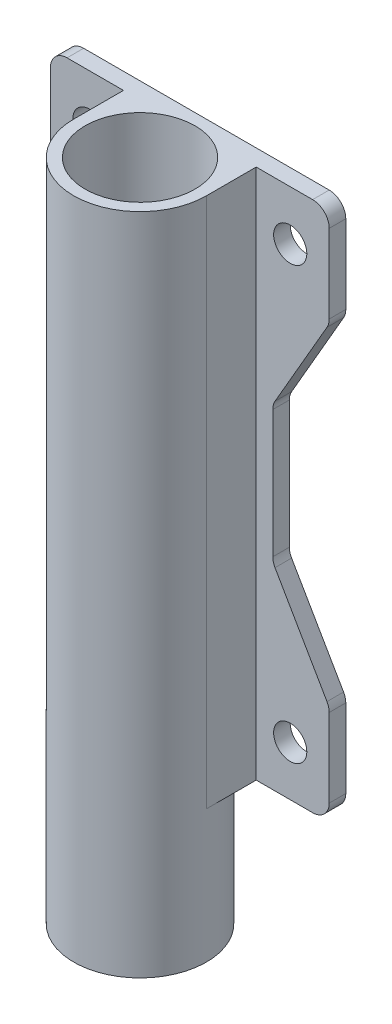
ISO-10303-21;
HEADER;
FILE_DESCRIPTION(('STEP AP214'),'2;1');
FILE_NAME('part.step','',(''),(''),'','','');
FILE_SCHEMA(('AUTOMOTIVE_DESIGN { 1 0 10303 214 1 1 1 1 }'));
ENDSEC;
DATA;
#1=APPLICATION_CONTEXT('core data for automotive mechanical design processes');
#2=APPLICATION_PROTOCOL_DEFINITION('international standard','automotive_design',2000,#1);
#3=PRODUCT_CONTEXT('',#1,'mechanical');
#4=PRODUCT('Part','Part','',(#3));
#5=PRODUCT_RELATED_PRODUCT_CATEGORY('part','',(#4));
#6=PRODUCT_DEFINITION_FORMATION('','',#4);
#7=PRODUCT_DEFINITION_CONTEXT('part definition',#1,'design');
#8=PRODUCT_DEFINITION('design','',#6,#7);
#9=PRODUCT_DEFINITION_SHAPE('','',#8);
#10=(LENGTH_UNIT() NAMED_UNIT(*) SI_UNIT(.MILLI.,.METRE.));
#11=(NAMED_UNIT(*) PLANE_ANGLE_UNIT() SI_UNIT($,.RADIAN.));
#12=(NAMED_UNIT(*) SI_UNIT($,.STERADIAN.) SOLID_ANGLE_UNIT());
#13=UNCERTAINTY_MEASURE_WITH_UNIT(LENGTH_MEASURE(1.E-05),#10,'distance_accuracy_value','');
#14=(GEOMETRIC_REPRESENTATION_CONTEXT(3) GLOBAL_UNCERTAINTY_ASSIGNED_CONTEXT((#13)) GLOBAL_UNIT_ASSIGNED_CONTEXT((#10,
#11,#12)) REPRESENTATION_CONTEXT('',''));
#15=CARTESIAN_POINT('',(0.,0.,0.));
#16=DIRECTION('',(0.,0.,1.));
#17=DIRECTION('',(1.,0.,0.));
#18=AXIS2_PLACEMENT_3D('',#15,#16,#17);
#19=CARTESIAN_POINT('',(-53.34,-101.6,6.35));
#20=DIRECTION('',(0.,1.,0.));
#21=DIRECTION('',(-1.,0.,0.));
#22=AXIS2_PLACEMENT_3D('',#19,#20,#21);
#23=PLANE('',#22);
#24=DIRECTION('',(1.,0.,0.));
#25=VECTOR('',#24,1.);
#26=CARTESIAN_POINT('',(-53.34,-101.6,0.));
#27=LINE('',#26,#25);
#28=CARTESIAN_POINT('',(0.,-101.6,0.));
#29=VERTEX_POINT('',#28);
#30=CARTESIAN_POINT('',(46.99,-101.6,0.));
#31=VERTEX_POINT('',#30);
#32=EDGE_CURVE('E239',#29,#31,#27,.T.);
#33=ORIENTED_EDGE('',*,*,#32,.T.);
#34=DIRECTION('',(0.,0.,-1.));
#35=VECTOR('',#34,1.);
#36=CARTESIAN_POINT('',(46.99,-101.6,6.35));
#37=LINE('',#36,#35);
#38=CARTESIAN_POINT('',(46.99,-101.6,6.35));
#39=VERTEX_POINT('',#38);
#40=EDGE_CURVE('E420',#31,#39,#37,.F.);
#41=ORIENTED_EDGE('',*,*,#40,.T.);
#42=DIRECTION('',(1.,0.,0.));
#43=VECTOR('',#42,1.);
#44=CARTESIAN_POINT('',(-53.34,-101.6,6.35));
#45=LINE('',#44,#43);
#46=CARTESIAN_POINT('',(25.4,-101.6,6.35));
#47=VERTEX_POINT('',#46);
#48=EDGE_CURVE('E341',#47,#39,#45,.T.);
#49=ORIENTED_EDGE('',*,*,#48,.F.);
#50=DIRECTION('',(0.,0.,-1.));
#51=VECTOR('',#50,1.);
#52=CARTESIAN_POINT('',(25.4,-101.6,0.));
#53=LINE('',#52,#51);
#54=CARTESIAN_POINT('',(25.4,-101.6,25.4));
#55=VERTEX_POINT('',#54);
#56=EDGE_CURVE('E256',#55,#47,#53,.T.);
#57=ORIENTED_EDGE('',*,*,#56,.F.);
#58=CARTESIAN_POINT('',(0.,-101.6,25.4));
#59=DIRECTION('',(0.,-1.,0.));
#60=DIRECTION('',(0.,0.,-1.));
#61=AXIS2_PLACEMENT_3D('',#58,#59,#60);
#62=CIRCLE('',#61,25.4);
#63=EDGE_CURVE('E253',#29,#55,#62,.T.);
#64=ORIENTED_EDGE('',*,*,#63,.F.);
#65=EDGE_LOOP('',(#33,#41,#49,#57,#64));
#66=FACE_BOUND('',#65,.T.);
#67=ADVANCED_FACE('F39',(#66),#23,.F.);
#68=CARTESIAN_POINT('',(0.,0.,6.35));
#69=DIRECTION('',(0.,0.,-1.));
#70=DIRECTION('',(-1.,0.,0.));
#71=AXIS2_PLACEMENT_3D('',#68,#69,#70);
#72=PLANE('',#71);
#73=CARTESIAN_POINT('',(38.4175,82.55,6.35));
#74=DIRECTION('',(0.,0.,1.));
#75=DIRECTION('',(-1.,0.,0.));
#76=AXIS2_PLACEMENT_3D('',#73,#74,#75);
#77=CIRCLE('',#76,6.35);
#78=CARTESIAN_POINT('',(32.0675,82.55,6.35));
#79=VERTEX_POINT('',#78);
#80=EDGE_CURVE('E297',#79,#79,#77,.T.);
#81=ORIENTED_EDGE('',*,*,#80,.F.);
#82=EDGE_LOOP('',(#81));
#83=FACE_BOUND('',#82,.T.);
#84=CARTESIAN_POINT('',(38.4175,-82.55,6.35));
#85=DIRECTION('',(0.,0.,1.));
#86=DIRECTION('',(1.,0.,0.));
#87=AXIS2_PLACEMENT_3D('',#84,#85,#86);
#88=CIRCLE('',#87,6.35);
#89=CARTESIAN_POINT('',(44.7675,-82.55,6.35));
#90=VERTEX_POINT('',#89);
#91=EDGE_CURVE('E303',#90,#90,#88,.T.);
#92=ORIENTED_EDGE('',*,*,#91,.F.);
#93=EDGE_LOOP('',(#92));
#94=FACE_BOUND('',#93,.T.);
#95=DIRECTION('',(0.,1.,0.));
#96=VECTOR('',#95,1.);
#97=CARTESIAN_POINT('',(53.34,-101.6,6.35));
#98=LINE('',#97,#96);
#99=CARTESIAN_POINT('',(53.34,-95.25,6.35));
#100=VERTEX_POINT('',#99);
#101=CARTESIAN_POINT('',(53.34,-65.2014773719376,6.35));
#102=VERTEX_POINT('',#101);
#103=EDGE_CURVE('E344',#100,#102,#98,.T.);
#104=ORIENTED_EDGE('',*,*,#103,.T.);
#105=CARTESIAN_POINT('',(46.99,-65.2014773719376,6.35));
#106=DIRECTION('',(0.,0.,-1.));
#107=DIRECTION('',(-1.,0.,0.));
#108=AXIS2_PLACEMENT_3D('',#105,#106,#107);
#109=CIRCLE('',#108,6.35);
#110=CARTESIAN_POINT('',(52.4892613140312,-62.0264773719377,6.35));
#111=VERTEX_POINT('',#110);
#112=EDGE_CURVE('E418',#102,#111,#109,.F.);
#113=ORIENTED_EDGE('',*,*,#112,.T.);
#114=DIRECTION('',(-0.499999999999994,0.866025403784442,0.));
#115=VECTOR('',#114,1.);
#116=CARTESIAN_POINT('',(53.34,-63.5,6.35));
#117=LINE('',#116,#115);
#118=CARTESIAN_POINT('',(32.6007386859688,-27.5785456926497,6.35));
#119=VERTEX_POINT('',#118);
#120=EDGE_CURVE('E347',#111,#119,#117,.T.);
#121=ORIENTED_EDGE('',*,*,#120,.T.);
#122=CARTESIAN_POINT('',(38.1,-24.4035456926497,6.35));
#123=DIRECTION('',(0.,0.,-1.));
#124=DIRECTION('',(-1.,0.,0.));
#125=AXIS2_PLACEMENT_3D('',#122,#123,#124);
#126=CIRCLE('',#125,6.35);
#127=CARTESIAN_POINT('',(31.75,-24.4035456926497,6.35));
#128=VERTEX_POINT('',#127);
#129=EDGE_CURVE('E467',#119,#128,#126,.T.);
#130=ORIENTED_EDGE('',*,*,#129,.T.);
#131=DIRECTION('',(0.,1.,0.));
#132=VECTOR('',#131,1.);
#133=CARTESIAN_POINT('',(31.75,26.1050230645874,6.35));
#134=LINE('',#133,#132);
#135=CARTESIAN_POINT('',(31.75,24.4035456926498,6.35));
#136=VERTEX_POINT('',#135);
#137=EDGE_CURVE('E273',#128,#136,#134,.T.);
#138=ORIENTED_EDGE('',*,*,#137,.T.);
#139=CARTESIAN_POINT('',(38.1,24.4035456926498,6.35));
#140=DIRECTION('',(0.,0.,-1.));
#141=DIRECTION('',(-1.,0.,0.));
#142=AXIS2_PLACEMENT_3D('',#139,#140,#141);
#143=CIRCLE('',#142,6.35);
#144=CARTESIAN_POINT('',(32.6007386859688,27.5785456926497,6.35));
#145=VERTEX_POINT('',#144);
#146=EDGE_CURVE('E471',#136,#145,#143,.T.);
#147=ORIENTED_EDGE('',*,*,#146,.T.);
#148=DIRECTION('',(0.499999999999994,0.866025403784442,0.));
#149=VECTOR('',#148,1.);
#150=CARTESIAN_POINT('',(53.34,63.5,6.35));
#151=LINE('',#150,#149);
#152=CARTESIAN_POINT('',(52.4892613140312,62.0264773719376,6.35));
#153=VERTEX_POINT('',#152);
#154=EDGE_CURVE('E269',#145,#153,#151,.T.);
#155=ORIENTED_EDGE('',*,*,#154,.T.);
#156=CARTESIAN_POINT('',(46.99,65.2014773719376,6.35));
#157=DIRECTION('',(0.,0.,-1.));
#158=DIRECTION('',(-1.,0.,0.));
#159=AXIS2_PLACEMENT_3D('',#156,#157,#158);
#160=CIRCLE('',#159,6.35);
#161=CARTESIAN_POINT('',(53.34,65.2014773719376,6.35));
#162=VERTEX_POINT('',#161);
#163=EDGE_CURVE('E414',#153,#162,#160,.F.);
#164=ORIENTED_EDGE('',*,*,#163,.T.);
#165=DIRECTION('',(0.,1.,0.));
#166=VECTOR('',#165,1.);
#167=CARTESIAN_POINT('',(53.34,63.5,6.35));
#168=LINE('',#167,#166);
#169=CARTESIAN_POINT('',(53.34,95.25,6.35));
#170=VERTEX_POINT('',#169);
#171=EDGE_CURVE('E321',#162,#170,#168,.T.);
#172=ORIENTED_EDGE('',*,*,#171,.T.);
#173=CARTESIAN_POINT('',(46.99,95.25,6.35));
#174=DIRECTION('',(0.,0.,-1.));
#175=DIRECTION('',(-1.,0.,0.));
#176=AXIS2_PLACEMENT_3D('',#173,#174,#175);
#177=CIRCLE('',#176,6.35);
#178=CARTESIAN_POINT('',(46.99,101.6,6.35));
#179=VERTEX_POINT('',#178);
#180=EDGE_CURVE('E412',#170,#179,#177,.F.);
#181=ORIENTED_EDGE('',*,*,#180,.T.);
#182=DIRECTION('',(-1.,0.,0.));
#183=VECTOR('',#182,1.);
#184=CARTESIAN_POINT('',(-53.34,101.6,6.35));
#185=LINE('',#184,#183);
#186=CARTESIAN_POINT('',(25.4,101.6,6.35));
#187=VERTEX_POINT('',#186);
#188=EDGE_CURVE('E326',#179,#187,#185,.T.);
#189=ORIENTED_EDGE('',*,*,#188,.T.);
#190=DIRECTION('',(0.,-1.,0.));
#191=VECTOR('',#190,1.);
#192=CARTESIAN_POINT('',(25.4,173.442048968553,6.35));
#193=LINE('',#192,#191);
#194=EDGE_CURVE('E281',#187,#47,#193,.T.);
#195=ORIENTED_EDGE('',*,*,#194,.T.);
#196=ORIENTED_EDGE('',*,*,#48,.T.);
#197=CARTESIAN_POINT('',(46.99,-95.25,6.35));
#198=DIRECTION('',(0.,0.,-1.));
#199=DIRECTION('',(-1.,0.,0.));
#200=AXIS2_PLACEMENT_3D('',#197,#198,#199);
#201=CIRCLE('',#200,6.35);
#202=EDGE_CURVE('E416',#39,#100,#201,.F.);
#203=ORIENTED_EDGE('',*,*,#202,.T.);
#204=EDGE_LOOP('',(#104,#113,#121,#130,#138,#147,#155,#164,#172,#181,#189,#195,#196,#203));
#205=FACE_BOUND('',#204,.T.);
#206=ADVANCED_FACE('F542',(#83,#94,#205),#72,.F.);
#207=DIRECTION('',(0.,-1.,0.));
#208=VECTOR('',#207,1.);
#209=CARTESIAN_POINT('',(-53.34,-101.6,6.35));
#210=LINE('',#209,#208);
#211=CARTESIAN_POINT('',(-53.34,-65.2014773719376,6.35));
#212=VERTEX_POINT('',#211);
#213=CARTESIAN_POINT('',(-53.34,-95.25,6.35));
#214=VERTEX_POINT('',#213);
#215=EDGE_CURVE('E338',#212,#214,#210,.T.);
#216=ORIENTED_EDGE('',*,*,#215,.T.);
#217=CARTESIAN_POINT('',(-46.99,-95.25,6.35));
#218=DIRECTION('',(0.,0.,-1.));
#219=DIRECTION('',(-1.,0.,0.));
#220=AXIS2_PLACEMENT_3D('',#217,#218,#219);
#221=CIRCLE('',#220,6.35);
#222=CARTESIAN_POINT('',(-46.99,-101.6,6.35));
#223=VERTEX_POINT('',#222);
#224=EDGE_CURVE('E434',#214,#223,#221,.F.);
#225=ORIENTED_EDGE('',*,*,#224,.T.);
#226=CARTESIAN_POINT('',(-25.4,-101.6,6.35));
#227=VERTEX_POINT('',#226);
#228=EDGE_CURVE('E342',#223,#227,#45,.T.);
#229=ORIENTED_EDGE('',*,*,#228,.T.);
#230=DIRECTION('',(0.,-1.,0.));
#231=VECTOR('',#230,1.);
#232=CARTESIAN_POINT('',(-25.4,173.442048968553,6.35));
#233=LINE('',#232,#231);
#234=CARTESIAN_POINT('',(-25.4,101.6,6.35));
#235=VERTEX_POINT('',#234);
#236=EDGE_CURVE('E290',#235,#227,#233,.T.);
#237=ORIENTED_EDGE('',*,*,#236,.F.);
#238=CARTESIAN_POINT('',(-46.99,101.6,6.35));
#239=VERTEX_POINT('',#238);
#240=EDGE_CURVE('E324',#235,#239,#185,.T.);
#241=ORIENTED_EDGE('',*,*,#240,.T.);
#242=CARTESIAN_POINT('',(-46.99,95.25,6.35));
#243=DIRECTION('',(0.,0.,-1.));
#244=DIRECTION('',(-1.,0.,0.));
#245=AXIS2_PLACEMENT_3D('',#242,#243,#244);
#246=CIRCLE('',#245,6.35);
#247=CARTESIAN_POINT('',(-53.34,95.25,6.35));
#248=VERTEX_POINT('',#247);
#249=EDGE_CURVE('E428',#239,#248,#246,.F.);
#250=ORIENTED_EDGE('',*,*,#249,.T.);
#251=DIRECTION('',(0.,-1.,0.));
#252=VECTOR('',#251,1.);
#253=CARTESIAN_POINT('',(-53.34,63.5,6.35));
#254=LINE('',#253,#252);
#255=CARTESIAN_POINT('',(-53.34,65.2014773719376,6.35));
#256=VERTEX_POINT('',#255);
#257=EDGE_CURVE('E328',#248,#256,#254,.T.);
#258=ORIENTED_EDGE('',*,*,#257,.T.);
#259=CARTESIAN_POINT('',(-46.99,65.2014773719376,6.35));
#260=DIRECTION('',(0.,0.,-1.));
#261=DIRECTION('',(-1.,0.,0.));
#262=AXIS2_PLACEMENT_3D('',#259,#260,#261);
#263=CIRCLE('',#262,6.35);
#264=CARTESIAN_POINT('',(-52.4892613140312,62.0264773719376,6.35));
#265=VERTEX_POINT('',#264);
#266=EDGE_CURVE('E430',#256,#265,#263,.F.);
#267=ORIENTED_EDGE('',*,*,#266,.T.);
#268=DIRECTION('',(0.499999999999995,-0.866025403784442,0.));
#269=VECTOR('',#268,1.);
#270=CARTESIAN_POINT('',(-53.34,63.5,6.35));
#271=LINE('',#270,#269);
#272=CARTESIAN_POINT('',(-32.6007386859688,27.5785456926497,6.35));
#273=VERTEX_POINT('',#272);
#274=EDGE_CURVE('E331',#265,#273,#271,.T.);
#275=ORIENTED_EDGE('',*,*,#274,.T.);
#276=CARTESIAN_POINT('',(-38.1,24.4035456926497,6.35));
#277=DIRECTION('',(0.,0.,-1.));
#278=DIRECTION('',(-1.,0.,0.));
#279=AXIS2_PLACEMENT_3D('',#276,#277,#278);
#280=CIRCLE('',#279,6.35);
#281=CARTESIAN_POINT('',(-31.75,24.4035456926497,6.35));
#282=VERTEX_POINT('',#281);
#283=EDGE_CURVE('E475',#273,#282,#280,.T.);
#284=ORIENTED_EDGE('',*,*,#283,.T.);
#285=DIRECTION('',(0.,-1.,0.));
#286=VECTOR('',#285,1.);
#287=CARTESIAN_POINT('',(-31.75,26.1050230645874,6.35));
#288=LINE('',#287,#286);
#289=CARTESIAN_POINT('',(-31.75,-24.4035456926498,6.35));
#290=VERTEX_POINT('',#289);
#291=EDGE_CURVE('E334',#282,#290,#288,.T.);
#292=ORIENTED_EDGE('',*,*,#291,.T.);
#293=CARTESIAN_POINT('',(-38.1,-24.4035456926498,6.35));
#294=DIRECTION('',(0.,0.,-1.));
#295=DIRECTION('',(-1.,0.,0.));
#296=AXIS2_PLACEMENT_3D('',#293,#294,#295);
#297=CIRCLE('',#296,6.35);
#298=CARTESIAN_POINT('',(-32.6007386859688,-27.5785456926497,6.35));
#299=VERTEX_POINT('',#298);
#300=EDGE_CURVE('E11',#290,#299,#297,.T.);
#301=ORIENTED_EDGE('',*,*,#300,.T.);
#302=DIRECTION('',(-0.499999999999995,-0.866025403784442,0.));
#303=VECTOR('',#302,1.);
#304=CARTESIAN_POINT('',(-53.34,-63.5,6.35));
#305=LINE('',#304,#303);
#306=CARTESIAN_POINT('',(-52.4892613140312,-62.0264773719376,6.35));
#307=VERTEX_POINT('',#306);
#308=EDGE_CURVE('E336',#299,#307,#305,.T.);
#309=ORIENTED_EDGE('',*,*,#308,.T.);
#310=CARTESIAN_POINT('',(-46.99,-65.2014773719376,6.35));
#311=DIRECTION('',(0.,0.,-1.));
#312=DIRECTION('',(-1.,0.,0.));
#313=AXIS2_PLACEMENT_3D('',#310,#311,#312);
#314=CIRCLE('',#313,6.35);
#315=EDGE_CURVE('E432',#307,#212,#314,.F.);
#316=ORIENTED_EDGE('',*,*,#315,.T.);
#317=EDGE_LOOP('',(#216,#225,#229,#237,#241,#250,#258,#267,#275,#284,#292,#301,#309,#316));
#318=FACE_BOUND('',#317,.T.);
#319=CARTESIAN_POINT('',(-38.4175,82.55,6.35));
#320=DIRECTION('',(0.,0.,1.));
#321=DIRECTION('',(1.,0.,0.));
#322=AXIS2_PLACEMENT_3D('',#319,#320,#321);
#323=CIRCLE('',#322,6.35);
#324=CARTESIAN_POINT('',(-32.0675,82.55,6.35));
#325=VERTEX_POINT('',#324);
#326=EDGE_CURVE('E315',#325,#325,#323,.T.);
#327=ORIENTED_EDGE('',*,*,#326,.F.);
#328=EDGE_LOOP('',(#327));
#329=FACE_BOUND('',#328,.T.);
#330=CARTESIAN_POINT('',(-38.4175,-82.55,6.35));
#331=DIRECTION('',(0.,0.,1.));
#332=DIRECTION('',(-1.,0.,0.));
#333=AXIS2_PLACEMENT_3D('',#330,#331,#332);
#334=CIRCLE('',#333,6.35);
#335=CARTESIAN_POINT('',(-44.7675,-82.55,6.35));
#336=VERTEX_POINT('',#335);
#337=EDGE_CURVE('E309',#336,#336,#334,.T.);
#338=ORIENTED_EDGE('',*,*,#337,.F.);
#339=EDGE_LOOP('',(#338));
#340=FACE_BOUND('',#339,.T.);
#341=ADVANCED_FACE('F488',(#318,#329,#340),#72,.F.);
#342=CARTESIAN_POINT('',(0.,0.,0.));
#343=DIRECTION('',(0.,0.,-1.));
#344=DIRECTION('',(-1.,0.,0.));
#345=AXIS2_PLACEMENT_3D('',#342,#343,#344);
#346=PLANE('',#345);
#347=DIRECTION('',(-0.499999999999994,0.866025403784442,0.));
#348=VECTOR('',#347,1.);
#349=CARTESIAN_POINT('',(53.34,-63.5,0.));
#350=LINE('',#349,#348);
#351=CARTESIAN_POINT('',(52.4892613140312,-62.0264773719377,0.));
#352=VERTEX_POINT('',#351);
#353=CARTESIAN_POINT('',(32.6007386859688,-27.5785456926497,0.));
#354=VERTEX_POINT('',#353);
#355=EDGE_CURVE('E372',#352,#354,#350,.T.);
#356=ORIENTED_EDGE('',*,*,#355,.F.);
#357=CARTESIAN_POINT('',(46.99,-65.2014773719376,0.));
#358=DIRECTION('',(0.,0.,-1.));
#359=DIRECTION('',(-1.,0.,0.));
#360=AXIS2_PLACEMENT_3D('',#357,#358,#359);
#361=CIRCLE('',#360,6.35);
#362=CARTESIAN_POINT('',(53.34,-65.2014773719376,0.));
#363=VERTEX_POINT('',#362);
#364=EDGE_CURVE('E405',#352,#363,#361,.T.);
#365=ORIENTED_EDGE('',*,*,#364,.T.);
#366=DIRECTION('',(0.,1.,0.));
#367=VECTOR('',#366,1.);
#368=CARTESIAN_POINT('',(53.34,-101.6,0.));
#369=LINE('',#368,#367);
#370=CARTESIAN_POINT('',(53.34,-95.25,0.));
#371=VERTEX_POINT('',#370);
#372=EDGE_CURVE('E238',#371,#363,#369,.T.);
#373=ORIENTED_EDGE('',*,*,#372,.F.);
#374=CARTESIAN_POINT('',(46.99,-95.25,0.));
#375=DIRECTION('',(0.,0.,-1.));
#376=DIRECTION('',(-1.,0.,0.));
#377=AXIS2_PLACEMENT_3D('',#374,#375,#376);
#378=CIRCLE('',#377,6.35);
#379=EDGE_CURVE('E247',#371,#31,#378,.T.);
#380=ORIENTED_EDGE('',*,*,#379,.T.);
#381=ORIENTED_EDGE('',*,*,#32,.F.);
#382=CARTESIAN_POINT('',(-46.99,-101.6,0.));
#383=VERTEX_POINT('',#382);
#384=EDGE_CURVE('E227',#383,#29,#27,.T.);
#385=ORIENTED_EDGE('',*,*,#384,.F.);
#386=CARTESIAN_POINT('',(-46.99,-95.25,0.));
#387=DIRECTION('',(0.,0.,-1.));
#388=DIRECTION('',(-1.,0.,0.));
#389=AXIS2_PLACEMENT_3D('',#386,#387,#388);
#390=CIRCLE('',#389,6.35);
#391=CARTESIAN_POINT('',(-53.34,-95.25,0.));
#392=VERTEX_POINT('',#391);
#393=EDGE_CURVE('E402',#383,#392,#390,.T.);
#394=ORIENTED_EDGE('',*,*,#393,.T.);
#395=DIRECTION('',(0.,-1.,0.));
#396=VECTOR('',#395,1.);
#397=CARTESIAN_POINT('',(-53.34,-101.6,0.));
#398=LINE('',#397,#396);
#399=CARTESIAN_POINT('',(-53.34,-65.2014773719376,0.));
#400=VERTEX_POINT('',#399);
#401=EDGE_CURVE('E250',#400,#392,#398,.T.);
#402=ORIENTED_EDGE('',*,*,#401,.F.);
#403=CARTESIAN_POINT('',(-46.99,-65.2014773719376,0.));
#404=DIRECTION('',(0.,0.,-1.));
#405=DIRECTION('',(-1.,0.,0.));
#406=AXIS2_PLACEMENT_3D('',#403,#404,#405);
#407=CIRCLE('',#406,6.35);
#408=CARTESIAN_POINT('',(-52.4892613140312,-62.0264773719376,0.));
#409=VERTEX_POINT('',#408);
#410=EDGE_CURVE('E400',#400,#409,#407,.T.);
#411=ORIENTED_EDGE('',*,*,#410,.T.);
#412=DIRECTION('',(-0.499999999999995,-0.866025403784442,0.));
#413=VECTOR('',#412,1.);
#414=CARTESIAN_POINT('',(-53.34,-63.5,0.));
#415=LINE('',#414,#413);
#416=CARTESIAN_POINT('',(-32.6007386859688,-27.5785456926497,0.));
#417=VERTEX_POINT('',#416);
#418=EDGE_CURVE('E366',#417,#409,#415,.T.);
#419=ORIENTED_EDGE('',*,*,#418,.F.);
#420=CARTESIAN_POINT('',(-38.1,-24.4035456926498,0.));
#421=DIRECTION('',(0.,0.,-1.));
#422=DIRECTION('',(-1.,0.,0.));
#423=AXIS2_PLACEMENT_3D('',#420,#421,#422);
#424=CIRCLE('',#423,6.35);
#425=CARTESIAN_POINT('',(-31.75,-24.4035456926498,0.));
#426=VERTEX_POINT('',#425);
#427=EDGE_CURVE('E47',#417,#426,#424,.F.);
#428=ORIENTED_EDGE('',*,*,#427,.T.);
#429=DIRECTION('',(0.,-1.,0.));
#430=VECTOR('',#429,1.);
#431=CARTESIAN_POINT('',(-31.75,26.1050230645874,0.));
#432=LINE('',#431,#430);
#433=CARTESIAN_POINT('',(-31.75,24.4035456926497,0.));
#434=VERTEX_POINT('',#433);
#435=EDGE_CURVE('E363',#434,#426,#432,.T.);
#436=ORIENTED_EDGE('',*,*,#435,.F.);
#437=CARTESIAN_POINT('',(-38.1,24.4035456926497,0.));
#438=DIRECTION('',(0.,0.,-1.));
#439=DIRECTION('',(-1.,0.,0.));
#440=AXIS2_PLACEMENT_3D('',#437,#438,#439);
#441=CIRCLE('',#440,6.35);
#442=CARTESIAN_POINT('',(-32.6007386859688,27.5785456926497,0.));
#443=VERTEX_POINT('',#442);
#444=EDGE_CURVE('E473',#434,#443,#441,.F.);
#445=ORIENTED_EDGE('',*,*,#444,.T.);
#446=DIRECTION('',(0.499999999999995,-0.866025403784442,0.));
#447=VECTOR('',#446,1.);
#448=CARTESIAN_POINT('',(-53.34,63.5,0.));
#449=LINE('',#448,#447);
#450=CARTESIAN_POINT('',(-52.4892613140312,62.0264773719376,0.));
#451=VERTEX_POINT('',#450);
#452=EDGE_CURVE('E360',#451,#443,#449,.T.);
#453=ORIENTED_EDGE('',*,*,#452,.F.);
#454=CARTESIAN_POINT('',(-46.99,65.2014773719376,0.));
#455=DIRECTION('',(0.,0.,-1.));
#456=DIRECTION('',(-1.,0.,0.));
#457=AXIS2_PLACEMENT_3D('',#454,#455,#456);
#458=CIRCLE('',#457,6.35);
#459=CARTESIAN_POINT('',(-53.34,65.2014773719376,0.));
#460=VERTEX_POINT('',#459);
#461=EDGE_CURVE('E398',#451,#460,#458,.T.);
#462=ORIENTED_EDGE('',*,*,#461,.T.);
#463=DIRECTION('',(0.,-1.,0.));
#464=VECTOR('',#463,1.);
#465=CARTESIAN_POINT('',(-53.34,63.5,0.));
#466=LINE('',#465,#464);
#467=CARTESIAN_POINT('',(-53.34,95.25,0.));
#468=VERTEX_POINT('',#467);
#469=EDGE_CURVE('E357',#468,#460,#466,.T.);
#470=ORIENTED_EDGE('',*,*,#469,.F.);
#471=CARTESIAN_POINT('',(-46.99,95.25,0.));
#472=DIRECTION('',(0.,0.,-1.));
#473=DIRECTION('',(-1.,0.,0.));
#474=AXIS2_PLACEMENT_3D('',#471,#472,#473);
#475=CIRCLE('',#474,6.35);
#476=CARTESIAN_POINT('',(-46.99,101.6,0.));
#477=VERTEX_POINT('',#476);
#478=EDGE_CURVE('E392',#468,#477,#475,.T.);
#479=ORIENTED_EDGE('',*,*,#478,.T.);
#480=DIRECTION('',(-1.,0.,0.));
#481=VECTOR('',#480,1.);
#482=CARTESIAN_POINT('',(-53.34,101.6,0.));
#483=LINE('',#482,#481);
#484=CARTESIAN_POINT('',(46.99,101.6,0.));
#485=VERTEX_POINT('',#484);
#486=EDGE_CURVE('E354',#485,#477,#483,.T.);
#487=ORIENTED_EDGE('',*,*,#486,.F.);
#488=CARTESIAN_POINT('',(46.99,95.25,0.));
#489=DIRECTION('',(0.,0.,-1.));
#490=DIRECTION('',(-1.,0.,0.));
#491=AXIS2_PLACEMENT_3D('',#488,#489,#490);
#492=CIRCLE('',#491,6.35);
#493=CARTESIAN_POINT('',(53.34,95.25,0.));
#494=VERTEX_POINT('',#493);
#495=EDGE_CURVE('E394',#485,#494,#492,.T.);
#496=ORIENTED_EDGE('',*,*,#495,.T.);
#497=DIRECTION('',(0.,1.,0.));
#498=VECTOR('',#497,1.);
#499=CARTESIAN_POINT('',(53.34,63.5,0.));
#500=LINE('',#499,#498);
#501=CARTESIAN_POINT('',(53.34,65.2014773719376,0.));
#502=VERTEX_POINT('',#501);
#503=EDGE_CURVE('E318',#502,#494,#500,.T.);
#504=ORIENTED_EDGE('',*,*,#503,.F.);
#505=CARTESIAN_POINT('',(46.99,65.2014773719376,0.));
#506=DIRECTION('',(0.,0.,-1.));
#507=DIRECTION('',(-1.,0.,0.));
#508=AXIS2_PLACEMENT_3D('',#505,#506,#507);
#509=CIRCLE('',#508,6.35);
#510=CARTESIAN_POINT('',(52.4892613140312,62.0264773719376,0.));
#511=VERTEX_POINT('',#510);
#512=EDGE_CURVE('E396',#502,#511,#509,.T.);
#513=ORIENTED_EDGE('',*,*,#512,.T.);
#514=DIRECTION('',(0.499999999999994,0.866025403784442,0.));
#515=VECTOR('',#514,1.);
#516=CARTESIAN_POINT('',(53.34,63.5,0.));
#517=LINE('',#516,#515);
#518=CARTESIAN_POINT('',(32.6007386859688,27.5785456926497,0.));
#519=VERTEX_POINT('',#518);
#520=EDGE_CURVE('E325',#519,#511,#517,.T.);
#521=ORIENTED_EDGE('',*,*,#520,.F.);
#522=CARTESIAN_POINT('',(38.1,24.4035456926498,0.));
#523=DIRECTION('',(0.,0.,-1.));
#524=DIRECTION('',(-1.,0.,0.));
#525=AXIS2_PLACEMENT_3D('',#522,#523,#524);
#526=CIRCLE('',#525,6.35);
#527=CARTESIAN_POINT('',(31.75,24.4035456926498,0.));
#528=VERTEX_POINT('',#527);
#529=EDGE_CURVE('E469',#519,#528,#526,.F.);
#530=ORIENTED_EDGE('',*,*,#529,.T.);
#531=DIRECTION('',(0.,1.,0.));
#532=VECTOR('',#531,1.);
#533=CARTESIAN_POINT('',(31.75,26.1050230645874,0.));
#534=LINE('',#533,#532);
#535=CARTESIAN_POINT('',(31.75,-24.4035456926497,0.));
#536=VERTEX_POINT('',#535);
#537=EDGE_CURVE('E375',#536,#528,#534,.T.);
#538=ORIENTED_EDGE('',*,*,#537,.F.);
#539=CARTESIAN_POINT('',(38.1,-24.4035456926497,0.));
#540=DIRECTION('',(0.,0.,-1.));
#541=DIRECTION('',(-1.,0.,0.));
#542=AXIS2_PLACEMENT_3D('',#539,#540,#541);
#543=CIRCLE('',#542,6.35);
#544=EDGE_CURVE('E465',#536,#354,#543,.F.);
#545=ORIENTED_EDGE('',*,*,#544,.T.);
#546=EDGE_LOOP('',(#356,#365,#373,#380,#381,#385,#394,#402,#411,#419,#428,#436,#445,#453,#462,
#470,#479,#487,#496,#504,#513,#521,#530,#538,#545));
#547=FACE_BOUND('',#546,.T.);
#548=CARTESIAN_POINT('',(38.4175,-82.55,0.));
#549=DIRECTION('',(0.,0.,1.));
#550=DIRECTION('',(1.,0.,0.));
#551=AXIS2_PLACEMENT_3D('',#548,#549,#550);
#552=CIRCLE('',#551,6.35);
#553=CARTESIAN_POINT('',(44.7675,-82.55,0.));
#554=VERTEX_POINT('',#553);
#555=EDGE_CURVE('E300',#554,#554,#552,.T.);
#556=ORIENTED_EDGE('',*,*,#555,.T.);
#557=EDGE_LOOP('',(#556));
#558=FACE_BOUND('',#557,.T.);
#559=CARTESIAN_POINT('',(38.4175,82.55,0.));
#560=DIRECTION('',(0.,0.,1.));
#561=DIRECTION('',(-1.,0.,0.));
#562=AXIS2_PLACEMENT_3D('',#559,#560,#561);
#563=CIRCLE('',#562,6.35);
#564=CARTESIAN_POINT('',(32.0675,82.55,0.));
#565=VERTEX_POINT('',#564);
#566=EDGE_CURVE('E296',#565,#565,#563,.T.);
#567=ORIENTED_EDGE('',*,*,#566,.T.);
#568=EDGE_LOOP('',(#567));
#569=FACE_BOUND('',#568,.T.);
#570=CARTESIAN_POINT('',(-38.4175,-82.55,0.));
#571=DIRECTION('',(0.,0.,1.));
#572=DIRECTION('',(-1.,0.,0.));
#573=AXIS2_PLACEMENT_3D('',#570,#571,#572);
#574=CIRCLE('',#573,6.35);
#575=CARTESIAN_POINT('',(-44.7675,-82.55,0.));
#576=VERTEX_POINT('',#575);
#577=EDGE_CURVE('E306',#576,#576,#574,.T.);
#578=ORIENTED_EDGE('',*,*,#577,.T.);
#579=EDGE_LOOP('',(#578));
#580=FACE_BOUND('',#579,.T.);
#581=CARTESIAN_POINT('',(-38.4175,82.55,0.));
#582=DIRECTION('',(0.,0.,1.));
#583=DIRECTION('',(1.,0.,0.));
#584=AXIS2_PLACEMENT_3D('',#581,#582,#583);
#585=CIRCLE('',#584,6.35);
#586=CARTESIAN_POINT('',(-32.0675,82.55,0.));
#587=VERTEX_POINT('',#586);
#588=EDGE_CURVE('E312',#587,#587,#585,.T.);
#589=ORIENTED_EDGE('',*,*,#588,.T.);
#590=EDGE_LOOP('',(#589));
#591=FACE_BOUND('',#590,.T.);
#592=ADVANCED_FACE('F244',(#547,#558,#569,#580,#591),#346,.T.);
#593=CARTESIAN_POINT('',(53.34,63.5,6.35));
#594=DIRECTION('',(-1.,0.,0.));
#595=DIRECTION('',(0.,-1.,0.));
#596=AXIS2_PLACEMENT_3D('',#593,#594,#595);
#597=PLANE('',#596);
#598=ORIENTED_EDGE('',*,*,#171,.F.);
#599=DIRECTION('',(0.,0.,-1.));
#600=VECTOR('',#599,1.);
#601=CARTESIAN_POINT('',(53.34,65.2014773719376,6.35));
#602=LINE('',#601,#600);
#603=EDGE_CURVE('E457',#162,#502,#602,.T.);
#604=ORIENTED_EDGE('',*,*,#603,.T.);
#605=ORIENTED_EDGE('',*,*,#503,.T.);
#606=DIRECTION('',(0.,0.,-1.));
#607=VECTOR('',#606,1.);
#608=CARTESIAN_POINT('',(53.34,95.25,6.35));
#609=LINE('',#608,#607);
#610=EDGE_CURVE('E455',#494,#170,#609,.F.);
#611=ORIENTED_EDGE('',*,*,#610,.T.);
#612=EDGE_LOOP('',(#598,#604,#605,#611));
#613=FACE_BOUND('',#612,.T.);
#614=ADVANCED_FACE('F537',(#613),#597,.F.);
#615=CARTESIAN_POINT('',(-53.34,101.6,6.35));
#616=DIRECTION('',(0.,-1.,0.));
#617=DIRECTION('',(0.,0.,-1.));
#618=AXIS2_PLACEMENT_3D('',#615,#616,#617);
#619=PLANE('',#618);
#620=CARTESIAN_POINT('',(0.,101.6,25.4));
#621=DIRECTION('',(0.,-1.,0.));
#622=DIRECTION('',(0.,0.,-1.));
#623=AXIS2_PLACEMENT_3D('',#620,#621,#622);
#624=CIRCLE('',#623,21.02866);
#625=CARTESIAN_POINT('',(0.,101.6,4.37134));
#626=VERTEX_POINT('',#625);
#627=EDGE_CURVE('E260',#626,#626,#624,.T.);
#628=ORIENTED_EDGE('',*,*,#627,.T.);
#629=EDGE_LOOP('',(#628));
#630=FACE_BOUND('',#629,.T.);
#631=ORIENTED_EDGE('',*,*,#188,.F.);
#632=DIRECTION('',(0.,0.,-1.));
#633=VECTOR('',#632,1.);
#634=CARTESIAN_POINT('',(46.99,101.6,6.35));
#635=LINE('',#634,#633);
#636=EDGE_CURVE('E462',#179,#485,#635,.T.);
#637=ORIENTED_EDGE('',*,*,#636,.T.);
#638=ORIENTED_EDGE('',*,*,#486,.T.);
#639=DIRECTION('',(0.,0.,-1.));
#640=VECTOR('',#639,1.);
#641=CARTESIAN_POINT('',(-46.99,101.6,6.35));
#642=LINE('',#641,#640);
#643=EDGE_CURVE('E460',#477,#239,#642,.F.);
#644=ORIENTED_EDGE('',*,*,#643,.T.);
#645=ORIENTED_EDGE('',*,*,#240,.F.);
#646=DIRECTION('',(0.,0.,1.));
#647=VECTOR('',#646,1.);
#648=CARTESIAN_POINT('',(-25.4,101.6,0.));
#649=LINE('',#648,#647);
#650=CARTESIAN_POINT('',(-25.4,101.6,25.4));
#651=VERTEX_POINT('',#650);
#652=EDGE_CURVE('E278',#235,#651,#649,.T.);
#653=ORIENTED_EDGE('',*,*,#652,.T.);
#654=CARTESIAN_POINT('',(0.,101.6,25.4));
#655=DIRECTION('',(0.,-1.,0.));
#656=DIRECTION('',(0.,0.,-1.));
#657=AXIS2_PLACEMENT_3D('',#654,#655,#656);
#658=CIRCLE('',#657,25.4);
#659=CARTESIAN_POINT('',(25.4,101.6,25.4));
#660=VERTEX_POINT('',#659);
#661=EDGE_CURVE('E284',#651,#660,#658,.F.);
#662=ORIENTED_EDGE('',*,*,#661,.T.);
#663=DIRECTION('',(0.,0.,1.));
#664=VECTOR('',#663,1.);
#665=CARTESIAN_POINT('',(25.4,101.6,0.));
#666=LINE('',#665,#664);
#667=EDGE_CURVE('E280',#187,#660,#666,.T.);
#668=ORIENTED_EDGE('',*,*,#667,.F.);
#669=EDGE_LOOP('',(#631,#637,#638,#644,#645,#653,#662,#668));
#670=FACE_BOUND('',#669,.T.);
#671=ADVANCED_FACE('F509',(#630,#670),#619,.F.);
#672=CARTESIAN_POINT('',(-53.34,63.5,6.35));
#673=DIRECTION('',(1.,0.,0.));
#674=DIRECTION('',(0.,1.,0.));
#675=AXIS2_PLACEMENT_3D('',#672,#673,#674);
#676=PLANE('',#675);
#677=ORIENTED_EDGE('',*,*,#469,.T.);
#678=DIRECTION('',(0.,0.,-1.));
#679=VECTOR('',#678,1.);
#680=CARTESIAN_POINT('',(-53.34,65.2014773719376,6.35));
#681=LINE('',#680,#679);
#682=EDGE_CURVE('E453',#460,#256,#681,.F.);
#683=ORIENTED_EDGE('',*,*,#682,.T.);
#684=ORIENTED_EDGE('',*,*,#257,.F.);
#685=DIRECTION('',(0.,0.,-1.));
#686=VECTOR('',#685,1.);
#687=CARTESIAN_POINT('',(-53.34,95.25,6.35));
#688=LINE('',#687,#686);
#689=EDGE_CURVE('E450',#248,#468,#688,.T.);
#690=ORIENTED_EDGE('',*,*,#689,.T.);
#691=EDGE_LOOP('',(#677,#683,#684,#690));
#692=FACE_BOUND('',#691,.T.);
#693=ADVANCED_FACE('F517',(#692),#676,.F.);
#694=CARTESIAN_POINT('',(-53.34,63.5,6.35));
#695=DIRECTION('',(0.866025403784442,0.499999999999995,0.));
#696=DIRECTION('',(-0.499999999999995,0.866025403784442,0.));
#697=AXIS2_PLACEMENT_3D('',#694,#695,#696);
#698=PLANE('',#697);
#699=ORIENTED_EDGE('',*,*,#452,.T.);
#700=DIRECTION('',(0.,0.,-1.));
#701=VECTOR('',#700,1.);
#702=CARTESIAN_POINT('',(-32.6007386859688,27.5785456926497,6.35));
#703=LINE('',#702,#701);
#704=EDGE_CURVE('E444',#443,#273,#703,.F.);
#705=ORIENTED_EDGE('',*,*,#704,.T.);
#706=ORIENTED_EDGE('',*,*,#274,.F.);
#707=DIRECTION('',(0.,0.,-1.));
#708=VECTOR('',#707,1.);
#709=CARTESIAN_POINT('',(-52.4892613140312,62.0264773719376,6.35));
#710=LINE('',#709,#708);
#711=EDGE_CURVE('E441',#265,#451,#710,.T.);
#712=ORIENTED_EDGE('',*,*,#711,.T.);
#713=EDGE_LOOP('',(#699,#705,#706,#712));
#714=FACE_BOUND('',#713,.T.);
#715=ADVANCED_FACE('F526',(#714),#698,.F.);
#716=CARTESIAN_POINT('',(-31.75,26.1050230645874,6.35));
#717=DIRECTION('',(1.,0.,0.));
#718=DIRECTION('',(0.,1.,0.));
#719=AXIS2_PLACEMENT_3D('',#716,#717,#718);
#720=PLANE('',#719);
#721=ORIENTED_EDGE('',*,*,#291,.F.);
#722=DIRECTION('',(0.,0.,-1.));
#723=VECTOR('',#722,1.);
#724=CARTESIAN_POINT('',(-31.75,24.4035456926497,0.));
#725=LINE('',#724,#723);
#726=EDGE_CURVE('E438',#282,#434,#725,.T.);
#727=ORIENTED_EDGE('',*,*,#726,.T.);
#728=ORIENTED_EDGE('',*,*,#435,.T.);
#729=DIRECTION('',(0.,0.,-1.));
#730=VECTOR('',#729,1.);
#731=CARTESIAN_POINT('',(-31.75,-24.4035456926498,6.35));
#732=LINE('',#731,#730);
#733=EDGE_CURVE('E436',#426,#290,#732,.F.);
#734=ORIENTED_EDGE('',*,*,#733,.T.);
#735=EDGE_LOOP('',(#721,#727,#728,#734));
#736=FACE_BOUND('',#735,.T.);
#737=ADVANCED_FACE('F483',(#736),#720,.F.);
#738=CARTESIAN_POINT('',(-53.34,-63.5,6.35));
#739=DIRECTION('',(0.866025403784442,-0.499999999999995,0.));
#740=DIRECTION('',(0.499999999999995,0.866025403784442,0.));
#741=AXIS2_PLACEMENT_3D('',#738,#739,#740);
#742=PLANE('',#741);
#743=ORIENTED_EDGE('',*,*,#308,.F.);
#744=DIRECTION('',(0.,0.,-1.));
#745=VECTOR('',#744,1.);
#746=CARTESIAN_POINT('',(-32.6007386859688,-27.5785456926497,0.));
#747=LINE('',#746,#745);
#748=EDGE_CURVE('E447',#299,#417,#747,.T.);
#749=ORIENTED_EDGE('',*,*,#748,.T.);
#750=ORIENTED_EDGE('',*,*,#418,.T.);
#751=DIRECTION('',(0.,0.,-1.));
#752=VECTOR('',#751,1.);
#753=CARTESIAN_POINT('',(-52.4892613140312,-62.0264773719376,6.35));
#754=LINE('',#753,#752);
#755=EDGE_CURVE('E54',#409,#307,#754,.F.);
#756=ORIENTED_EDGE('',*,*,#755,.T.);
#757=EDGE_LOOP('',(#743,#749,#750,#756));
#758=FACE_BOUND('',#757,.T.);
#759=ADVANCED_FACE('F486',(#758),#742,.F.);
#760=CARTESIAN_POINT('',(-53.34,-101.6,6.35));
#761=DIRECTION('',(1.,0.,0.));
#762=DIRECTION('',(0.,1.,0.));
#763=AXIS2_PLACEMENT_3D('',#760,#761,#762);
#764=PLANE('',#763);
#765=ORIENTED_EDGE('',*,*,#401,.T.);
#766=DIRECTION('',(0.,0.,-1.));
#767=VECTOR('',#766,1.);
#768=CARTESIAN_POINT('',(-53.34,-95.25,6.35));
#769=LINE('',#768,#767);
#770=EDGE_CURVE('E426',#392,#214,#769,.F.);
#771=ORIENTED_EDGE('',*,*,#770,.T.);
#772=ORIENTED_EDGE('',*,*,#215,.F.);
#773=DIRECTION('',(0.,0.,-1.));
#774=VECTOR('',#773,1.);
#775=CARTESIAN_POINT('',(-53.34,-65.2014773719376,6.35));
#776=LINE('',#775,#774);
#777=EDGE_CURVE('E423',#212,#400,#776,.T.);
#778=ORIENTED_EDGE('',*,*,#777,.T.);
#779=EDGE_LOOP('',(#765,#771,#772,#778));
#780=FACE_BOUND('',#779,.T.);
#781=ADVANCED_FACE('F496',(#780),#764,.F.);
#782=ORIENTED_EDGE('',*,*,#228,.F.);
#783=DIRECTION('',(0.,0.,-1.));
#784=VECTOR('',#783,1.);
#785=CARTESIAN_POINT('',(-46.99,-101.6,6.35));
#786=LINE('',#785,#784);
#787=EDGE_CURVE('E236',#223,#383,#786,.T.);
#788=ORIENTED_EDGE('',*,*,#787,.T.);
#789=ORIENTED_EDGE('',*,*,#384,.T.);
#790=CARTESIAN_POINT('',(-25.4,-101.6,25.4));
#791=VERTEX_POINT('',#790);
#792=EDGE_CURVE('E233',#791,#29,#62,.T.);
#793=ORIENTED_EDGE('',*,*,#792,.F.);
#794=DIRECTION('',(0.,0.,-1.));
#795=VECTOR('',#794,1.);
#796=CARTESIAN_POINT('',(-25.4,-101.6,0.));
#797=LINE('',#796,#795);
#798=EDGE_CURVE('E286',#791,#227,#797,.T.);
#799=ORIENTED_EDGE('',*,*,#798,.T.);
#800=EDGE_LOOP('',(#782,#788,#789,#793,#799));
#801=FACE_BOUND('',#800,.T.);
#802=ADVANCED_FACE('F230',(#801),#23,.F.);
#803=CARTESIAN_POINT('',(53.34,-101.6,6.35));
#804=DIRECTION('',(-1.,0.,0.));
#805=DIRECTION('',(0.,-1.,0.));
#806=AXIS2_PLACEMENT_3D('',#803,#804,#805);
#807=PLANE('',#806);
#808=ORIENTED_EDGE('',*,*,#372,.T.);
#809=DIRECTION('',(0.,0.,-1.));
#810=VECTOR('',#809,1.);
#811=CARTESIAN_POINT('',(53.34,-65.2014773719376,6.35));
#812=LINE('',#811,#810);
#813=EDGE_CURVE('E410',#363,#102,#812,.F.);
#814=ORIENTED_EDGE('',*,*,#813,.T.);
#815=ORIENTED_EDGE('',*,*,#103,.F.);
#816=DIRECTION('',(0.,0.,-1.));
#817=VECTOR('',#816,1.);
#818=CARTESIAN_POINT('',(53.34,-95.25,6.35));
#819=LINE('',#818,#817);
#820=EDGE_CURVE('E407',#100,#371,#819,.T.);
#821=ORIENTED_EDGE('',*,*,#820,.T.);
#822=EDGE_LOOP('',(#808,#814,#815,#821));
#823=FACE_BOUND('',#822,.T.);
#824=ADVANCED_FACE('F555',(#823),#807,.F.);
#825=CARTESIAN_POINT('',(53.34,-63.5,6.35));
#826=DIRECTION('',(-0.866025403784442,-0.499999999999994,0.));
#827=DIRECTION('',(0.499999999999994,-0.866025403784442,0.));
#828=AXIS2_PLACEMENT_3D('',#825,#826,#827);
#829=PLANE('',#828);
#830=ORIENTED_EDGE('',*,*,#355,.T.);
#831=DIRECTION('',(0.,0.,-1.));
#832=VECTOR('',#831,1.);
#833=CARTESIAN_POINT('',(32.6007386859688,-27.5785456926497,6.35));
#834=LINE('',#833,#832);
#835=EDGE_CURVE('E385',#354,#119,#834,.F.);
#836=ORIENTED_EDGE('',*,*,#835,.T.);
#837=ORIENTED_EDGE('',*,*,#120,.F.);
#838=DIRECTION('',(0.,0.,-1.));
#839=VECTOR('',#838,1.);
#840=CARTESIAN_POINT('',(52.4892613140312,-62.0264773719377,6.35));
#841=LINE('',#840,#839);
#842=EDGE_CURVE('E382',#111,#352,#841,.T.);
#843=ORIENTED_EDGE('',*,*,#842,.T.);
#844=EDGE_LOOP('',(#830,#836,#837,#843));
#845=FACE_BOUND('',#844,.T.);
#846=ADVANCED_FACE('F563',(#845),#829,.F.);
#847=CARTESIAN_POINT('',(31.75,26.1050230645874,6.35));
#848=DIRECTION('',(-1.,0.,0.));
#849=DIRECTION('',(0.,-1.,0.));
#850=AXIS2_PLACEMENT_3D('',#847,#848,#849);
#851=PLANE('',#850);
#852=ORIENTED_EDGE('',*,*,#137,.F.);
#853=DIRECTION('',(0.,0.,-1.));
#854=VECTOR('',#853,1.);
#855=CARTESIAN_POINT('',(31.75,-24.4035456926497,0.));
#856=LINE('',#855,#854);
#857=EDGE_CURVE('E270',#128,#536,#856,.T.);
#858=ORIENTED_EDGE('',*,*,#857,.T.);
#859=ORIENTED_EDGE('',*,*,#537,.T.);
#860=DIRECTION('',(0.,0.,-1.));
#861=VECTOR('',#860,1.);
#862=CARTESIAN_POINT('',(31.75,24.4035456926498,6.35));
#863=LINE('',#862,#861);
#864=EDGE_CURVE('E268',#528,#136,#863,.F.);
#865=ORIENTED_EDGE('',*,*,#864,.T.);
#866=EDGE_LOOP('',(#852,#858,#859,#865));
#867=FACE_BOUND('',#866,.T.);
#868=ADVANCED_FACE('F571',(#867),#851,.F.);
#869=CARTESIAN_POINT('',(53.34,63.5,6.35));
#870=DIRECTION('',(-0.866025403784442,0.499999999999994,0.));
#871=DIRECTION('',(-0.499999999999994,-0.866025403784442,0.));
#872=AXIS2_PLACEMENT_3D('',#869,#870,#871);
#873=PLANE('',#872);
#874=ORIENTED_EDGE('',*,*,#154,.F.);
#875=DIRECTION('',(0.,0.,-1.));
#876=VECTOR('',#875,1.);
#877=CARTESIAN_POINT('',(32.6007386859688,27.5785456926497,0.));
#878=LINE('',#877,#876);
#879=EDGE_CURVE('E389',#145,#519,#878,.T.);
#880=ORIENTED_EDGE('',*,*,#879,.T.);
#881=ORIENTED_EDGE('',*,*,#520,.T.);
#882=DIRECTION('',(0.,0.,-1.));
#883=VECTOR('',#882,1.);
#884=CARTESIAN_POINT('',(52.4892613140312,62.0264773719376,6.35));
#885=LINE('',#884,#883);
#886=EDGE_CURVE('E387',#511,#153,#885,.F.);
#887=ORIENTED_EDGE('',*,*,#886,.T.);
#888=EDGE_LOOP('',(#874,#880,#881,#887));
#889=FACE_BOUND('',#888,.T.);
#890=ADVANCED_FACE('F580',(#889),#873,.F.);
#891=CARTESIAN_POINT('',(-38.4175,82.55,6.35));
#892=DIRECTION('',(0.,0.,-1.));
#893=DIRECTION('',(-1.,0.,0.));
#894=AXIS2_PLACEMENT_3D('',#891,#892,#893);
#895=CYLINDRICAL_SURFACE('',#894,6.35);
#896=ORIENTED_EDGE('',*,*,#326,.T.);
#897=EDGE_LOOP('',(#896));
#898=FACE_BOUND('',#897,.T.);
#899=ORIENTED_EDGE('',*,*,#588,.F.);
#900=EDGE_LOOP('',(#899));
#901=FACE_BOUND('',#900,.T.);
#902=ADVANCED_FACE('F836',(#898,#901),#895,.F.);
#903=CARTESIAN_POINT('',(-38.4175,-82.55,6.35));
#904=DIRECTION('',(0.,0.,-1.));
#905=DIRECTION('',(-1.,0.,0.));
#906=AXIS2_PLACEMENT_3D('',#903,#904,#905);
#907=CYLINDRICAL_SURFACE('',#906,6.35);
#908=ORIENTED_EDGE('',*,*,#337,.T.);
#909=EDGE_LOOP('',(#908));
#910=FACE_BOUND('',#909,.T.);
#911=ORIENTED_EDGE('',*,*,#577,.F.);
#912=EDGE_LOOP('',(#911));
#913=FACE_BOUND('',#912,.T.);
#914=ADVANCED_FACE('F846',(#910,#913),#907,.F.);
#915=CARTESIAN_POINT('',(38.4175,-82.55,6.35));
#916=DIRECTION('',(0.,0.,-1.));
#917=DIRECTION('',(-1.,0.,0.));
#918=AXIS2_PLACEMENT_3D('',#915,#916,#917);
#919=CYLINDRICAL_SURFACE('',#918,6.35);
#920=ORIENTED_EDGE('',*,*,#91,.T.);
#921=EDGE_LOOP('',(#920));
#922=FACE_BOUND('',#921,.T.);
#923=ORIENTED_EDGE('',*,*,#555,.F.);
#924=EDGE_LOOP('',(#923));
#925=FACE_BOUND('',#924,.T.);
#926=ADVANCED_FACE('F853',(#922,#925),#919,.F.);
#927=CARTESIAN_POINT('',(38.4175,82.55,6.35));
#928=DIRECTION('',(0.,0.,-1.));
#929=DIRECTION('',(-1.,0.,0.));
#930=AXIS2_PLACEMENT_3D('',#927,#928,#929);
#931=CYLINDRICAL_SURFACE('',#930,6.35);
#932=ORIENTED_EDGE('',*,*,#80,.T.);
#933=EDGE_LOOP('',(#932));
#934=FACE_BOUND('',#933,.T.);
#935=ORIENTED_EDGE('',*,*,#566,.F.);
#936=EDGE_LOOP('',(#935));
#937=FACE_BOUND('',#936,.T.);
#938=ADVANCED_FACE('F861',(#934,#937),#931,.F.);
#939=CARTESIAN_POINT('',(25.4,173.442048968553,0.));
#940=DIRECTION('',(-1.,0.,0.));
#941=DIRECTION('',(0.,0.,1.));
#942=AXIS2_PLACEMENT_3D('',#939,#940,#941);
#943=PLANE('',#942);
#944=ORIENTED_EDGE('',*,*,#194,.F.);
#945=ORIENTED_EDGE('',*,*,#667,.T.);
#946=DIRECTION('',(0.,-1.,0.));
#947=VECTOR('',#946,1.);
#948=CARTESIAN_POINT('',(25.4,173.442048968553,25.4));
#949=LINE('',#948,#947);
#950=EDGE_CURVE('E288',#660,#55,#949,.T.);
#951=ORIENTED_EDGE('',*,*,#950,.T.);
#952=ORIENTED_EDGE('',*,*,#56,.T.);
#953=EDGE_LOOP('',(#944,#945,#951,#952));
#954=FACE_BOUND('',#953,.T.);
#955=ADVANCED_FACE('F546',(#954),#943,.F.);
#956=CARTESIAN_POINT('',(-25.4,173.442048968553,0.));
#957=DIRECTION('',(-1.,0.,0.));
#958=DIRECTION('',(0.,0.,1.));
#959=AXIS2_PLACEMENT_3D('',#956,#957,#958);
#960=PLANE('',#959);
#961=ORIENTED_EDGE('',*,*,#652,.F.);
#962=ORIENTED_EDGE('',*,*,#236,.T.);
#963=ORIENTED_EDGE('',*,*,#798,.F.);
#964=DIRECTION('',(0.,-1.,0.));
#965=VECTOR('',#964,1.);
#966=CARTESIAN_POINT('',(-25.4,173.442048968553,25.4));
#967=LINE('',#966,#965);
#968=EDGE_CURVE('E266',#651,#791,#967,.T.);
#969=ORIENTED_EDGE('',*,*,#968,.F.);
#970=EDGE_LOOP('',(#961,#962,#963,#969));
#971=FACE_BOUND('',#970,.T.);
#972=ADVANCED_FACE('F503',(#971),#960,.T.);
#973=CARTESIAN_POINT('',(0.,173.442048968553,25.4));
#974=DIRECTION('',(0.,-1.,0.));
#975=DIRECTION('',(0.,0.,-1.));
#976=AXIS2_PLACEMENT_3D('',#973,#974,#975);
#977=CYLINDRICAL_SURFACE('',#976,25.4);
#978=ORIENTED_EDGE('',*,*,#661,.F.);
#979=ORIENTED_EDGE('',*,*,#968,.T.);
#980=ORIENTED_EDGE('',*,*,#792,.T.);
#981=ORIENTED_EDGE('',*,*,#63,.T.);
#982=ORIENTED_EDGE('',*,*,#950,.F.);
#983=EDGE_LOOP('',(#978,#979,#980,#981,#982));
#984=FACE_BOUND('',#983,.T.);
#985=CARTESIAN_POINT('',(0.,-152.4,25.4));
#986=DIRECTION('',(0.,-1.,0.));
#987=DIRECTION('',(0.,0.,-1.));
#988=AXIS2_PLACEMENT_3D('',#985,#986,#987);
#989=CIRCLE('',#988,25.4);
#990=CARTESIAN_POINT('',(0.,-152.4,0.));
#991=VERTEX_POINT('',#990);
#992=EDGE_CURVE('E259',#991,#991,#989,.T.);
#993=ORIENTED_EDGE('',*,*,#992,.F.);
#994=EDGE_LOOP('',(#993));
#995=FACE_BOUND('',#994,.T.);
#996=ADVANCED_FACE('F263',(#984,#995),#977,.T.);
#997=CARTESIAN_POINT('',(0.,-152.4,25.4));
#998=DIRECTION('',(0.,-1.,0.));
#999=DIRECTION('',(0.,0.,-1.));
#1000=AXIS2_PLACEMENT_3D('',#997,#998,#999);
#1001=PLANE('',#1000);
#1002=CARTESIAN_POINT('',(0.,-152.4,25.4));
#1003=DIRECTION('',(0.,-1.,0.));
#1004=DIRECTION('',(0.,0.,-1.));
#1005=AXIS2_PLACEMENT_3D('',#1002,#1003,#1004);
#1006=CIRCLE('',#1005,21.02866);
#1007=CARTESIAN_POINT('',(0.,-152.4,4.37134));
#1008=VERTEX_POINT('',#1007);
#1009=EDGE_CURVE('E932',#1008,#1008,#1006,.T.);
#1010=ORIENTED_EDGE('',*,*,#1009,.F.);
#1011=EDGE_LOOP('',(#1010));
#1012=FACE_BOUND('',#1011,.T.);
#1013=ORIENTED_EDGE('',*,*,#992,.T.);
#1014=EDGE_LOOP('',(#1013));
#1015=FACE_BOUND('',#1014,.T.);
#1016=ADVANCED_FACE('F710',(#1012,#1015),#1001,.T.);
#1017=CARTESIAN_POINT('',(0.,101.6,25.4));
#1018=DIRECTION('',(0.,-1.,0.));
#1019=DIRECTION('',(0.,0.,-1.));
#1020=AXIS2_PLACEMENT_3D('',#1017,#1018,#1019);
#1021=CYLINDRICAL_SURFACE('',#1020,21.02866);
#1022=ORIENTED_EDGE('',*,*,#627,.F.);
#1023=EDGE_LOOP('',(#1022));
#1024=FACE_BOUND('',#1023,.T.);
#1025=ORIENTED_EDGE('',*,*,#1009,.T.);
#1026=EDGE_LOOP('',(#1025));
#1027=FACE_BOUND('',#1026,.T.);
#1028=ADVANCED_FACE('F624',(#1024,#1027),#1021,.F.);
#1029=CARTESIAN_POINT('',(38.1,-24.4035456926497,6.35));
#1030=DIRECTION('',(0.,0.,1.));
#1031=DIRECTION('',(1.,0.,0.));
#1032=AXIS2_PLACEMENT_3D('',#1029,#1030,#1031);
#1033=CYLINDRICAL_SURFACE('',#1032,6.35);
#1034=ORIENTED_EDGE('',*,*,#129,.F.);
#1035=ORIENTED_EDGE('',*,*,#835,.F.);
#1036=ORIENTED_EDGE('',*,*,#544,.F.);
#1037=ORIENTED_EDGE('',*,*,#857,.F.);
#1038=EDGE_LOOP('',(#1034,#1035,#1036,#1037));
#1039=FACE_BOUND('',#1038,.T.);
#1040=ADVANCED_FACE('F566',(#1039),#1033,.F.);
#1041=CARTESIAN_POINT('',(38.1,24.4035456926498,6.35));
#1042=DIRECTION('',(0.,0.,1.));
#1043=DIRECTION('',(1.,0.,0.));
#1044=AXIS2_PLACEMENT_3D('',#1041,#1042,#1043);
#1045=CYLINDRICAL_SURFACE('',#1044,6.35);
#1046=ORIENTED_EDGE('',*,*,#146,.F.);
#1047=ORIENTED_EDGE('',*,*,#864,.F.);
#1048=ORIENTED_EDGE('',*,*,#529,.F.);
#1049=ORIENTED_EDGE('',*,*,#879,.F.);
#1050=EDGE_LOOP('',(#1046,#1047,#1048,#1049));
#1051=FACE_BOUND('',#1050,.T.);
#1052=ADVANCED_FACE('F575',(#1051),#1045,.F.);
#1053=CARTESIAN_POINT('',(46.99,-65.2014773719376,6.35));
#1054=DIRECTION('',(0.,0.,-1.));
#1055=DIRECTION('',(-1.,0.,0.));
#1056=AXIS2_PLACEMENT_3D('',#1053,#1054,#1055);
#1057=CYLINDRICAL_SURFACE('',#1056,6.35);
#1058=ORIENTED_EDGE('',*,*,#112,.F.);
#1059=ORIENTED_EDGE('',*,*,#813,.F.);
#1060=ORIENTED_EDGE('',*,*,#364,.F.);
#1061=ORIENTED_EDGE('',*,*,#842,.F.);
#1062=EDGE_LOOP('',(#1058,#1059,#1060,#1061));
#1063=FACE_BOUND('',#1062,.T.);
#1064=ADVANCED_FACE('F558',(#1063),#1057,.T.);
#1065=CARTESIAN_POINT('',(46.99,-95.25,6.35));
#1066=DIRECTION('',(0.,0.,-1.));
#1067=DIRECTION('',(-1.,0.,0.));
#1068=AXIS2_PLACEMENT_3D('',#1065,#1066,#1067);
#1069=CYLINDRICAL_SURFACE('',#1068,6.35);
#1070=ORIENTED_EDGE('',*,*,#202,.F.);
#1071=ORIENTED_EDGE('',*,*,#40,.F.);
#1072=ORIENTED_EDGE('',*,*,#379,.F.);
#1073=ORIENTED_EDGE('',*,*,#820,.F.);
#1074=EDGE_LOOP('',(#1070,#1071,#1072,#1073));
#1075=FACE_BOUND('',#1074,.T.);
#1076=ADVANCED_FACE('F550',(#1075),#1069,.T.);
#1077=CARTESIAN_POINT('',(-46.99,-95.25,6.35));
#1078=DIRECTION('',(0.,0.,-1.));
#1079=DIRECTION('',(-1.,0.,0.));
#1080=AXIS2_PLACEMENT_3D('',#1077,#1078,#1079);
#1081=CYLINDRICAL_SURFACE('',#1080,6.35);
#1082=ORIENTED_EDGE('',*,*,#224,.F.);
#1083=ORIENTED_EDGE('',*,*,#770,.F.);
#1084=ORIENTED_EDGE('',*,*,#393,.F.);
#1085=ORIENTED_EDGE('',*,*,#787,.F.);
#1086=EDGE_LOOP('',(#1082,#1083,#1084,#1085));
#1087=FACE_BOUND('',#1086,.T.);
#1088=ADVANCED_FACE('F500',(#1087),#1081,.T.);
#1089=CARTESIAN_POINT('',(-38.1,24.4035456926497,6.35));
#1090=DIRECTION('',(0.,0.,1.));
#1091=DIRECTION('',(1.,0.,0.));
#1092=AXIS2_PLACEMENT_3D('',#1089,#1090,#1091);
#1093=CYLINDRICAL_SURFACE('',#1092,6.35);
#1094=ORIENTED_EDGE('',*,*,#283,.F.);
#1095=ORIENTED_EDGE('',*,*,#704,.F.);
#1096=ORIENTED_EDGE('',*,*,#444,.F.);
#1097=ORIENTED_EDGE('',*,*,#726,.F.);
#1098=EDGE_LOOP('',(#1094,#1095,#1096,#1097));
#1099=FACE_BOUND('',#1098,.T.);
#1100=ADVANCED_FACE('F530',(#1099),#1093,.F.);
#1101=CARTESIAN_POINT('',(-38.1,-24.4035456926498,6.35));
#1102=DIRECTION('',(0.,0.,1.));
#1103=DIRECTION('',(1.,0.,0.));
#1104=AXIS2_PLACEMENT_3D('',#1101,#1102,#1103);
#1105=CYLINDRICAL_SURFACE('',#1104,6.35);
#1106=ORIENTED_EDGE('',*,*,#300,.F.);
#1107=ORIENTED_EDGE('',*,*,#733,.F.);
#1108=ORIENTED_EDGE('',*,*,#427,.F.);
#1109=ORIENTED_EDGE('',*,*,#748,.F.);
#1110=EDGE_LOOP('',(#1106,#1107,#1108,#1109));
#1111=FACE_BOUND('',#1110,.T.);
#1112=ADVANCED_FACE('F485',(#1111),#1105,.F.);
#1113=CARTESIAN_POINT('',(-46.99,-65.2014773719376,6.35));
#1114=DIRECTION('',(0.,0.,-1.));
#1115=DIRECTION('',(-1.,0.,0.));
#1116=AXIS2_PLACEMENT_3D('',#1113,#1114,#1115);
#1117=CYLINDRICAL_SURFACE('',#1116,6.35);
#1118=ORIENTED_EDGE('',*,*,#315,.F.);
#1119=ORIENTED_EDGE('',*,*,#755,.F.);
#1120=ORIENTED_EDGE('',*,*,#410,.F.);
#1121=ORIENTED_EDGE('',*,*,#777,.F.);
#1122=EDGE_LOOP('',(#1118,#1119,#1120,#1121));
#1123=FACE_BOUND('',#1122,.T.);
#1124=ADVANCED_FACE('F493',(#1123),#1117,.T.);
#1125=CARTESIAN_POINT('',(-46.99,65.2014773719376,6.35));
#1126=DIRECTION('',(0.,0.,-1.));
#1127=DIRECTION('',(-1.,0.,0.));
#1128=AXIS2_PLACEMENT_3D('',#1125,#1126,#1127);
#1129=CYLINDRICAL_SURFACE('',#1128,6.35);
#1130=ORIENTED_EDGE('',*,*,#266,.F.);
#1131=ORIENTED_EDGE('',*,*,#682,.F.);
#1132=ORIENTED_EDGE('',*,*,#461,.F.);
#1133=ORIENTED_EDGE('',*,*,#711,.F.);
#1134=EDGE_LOOP('',(#1130,#1131,#1132,#1133));
#1135=FACE_BOUND('',#1134,.T.);
#1136=ADVANCED_FACE('F521',(#1135),#1129,.T.);
#1137=CARTESIAN_POINT('',(46.99,65.2014773719376,6.35));
#1138=DIRECTION('',(0.,0.,-1.));
#1139=DIRECTION('',(-1.,0.,0.));
#1140=AXIS2_PLACEMENT_3D('',#1137,#1138,#1139);
#1141=CYLINDRICAL_SURFACE('',#1140,6.35);
#1142=ORIENTED_EDGE('',*,*,#163,.F.);
#1143=ORIENTED_EDGE('',*,*,#886,.F.);
#1144=ORIENTED_EDGE('',*,*,#512,.F.);
#1145=ORIENTED_EDGE('',*,*,#603,.F.);
#1146=EDGE_LOOP('',(#1142,#1143,#1144,#1145));
#1147=FACE_BOUND('',#1146,.T.);
#1148=ADVANCED_FACE('F584',(#1147),#1141,.T.);
#1149=CARTESIAN_POINT('',(46.99,95.25,6.35));
#1150=DIRECTION('',(0.,0.,-1.));
#1151=DIRECTION('',(-1.,0.,0.));
#1152=AXIS2_PLACEMENT_3D('',#1149,#1150,#1151);
#1153=CYLINDRICAL_SURFACE('',#1152,6.35);
#1154=ORIENTED_EDGE('',*,*,#180,.F.);
#1155=ORIENTED_EDGE('',*,*,#610,.F.);
#1156=ORIENTED_EDGE('',*,*,#495,.F.);
#1157=ORIENTED_EDGE('',*,*,#636,.F.);
#1158=EDGE_LOOP('',(#1154,#1155,#1156,#1157));
#1159=FACE_BOUND('',#1158,.T.);
#1160=ADVANCED_FACE('F540',(#1159),#1153,.T.);
#1161=CARTESIAN_POINT('',(-46.99,95.25,6.35));
#1162=DIRECTION('',(0.,0.,-1.));
#1163=DIRECTION('',(-1.,0.,0.));
#1164=AXIS2_PLACEMENT_3D('',#1161,#1162,#1163);
#1165=CYLINDRICAL_SURFACE('',#1164,6.35);
#1166=ORIENTED_EDGE('',*,*,#249,.F.);
#1167=ORIENTED_EDGE('',*,*,#643,.F.);
#1168=ORIENTED_EDGE('',*,*,#478,.F.);
#1169=ORIENTED_EDGE('',*,*,#689,.F.);
#1170=EDGE_LOOP('',(#1166,#1167,#1168,#1169));
#1171=FACE_BOUND('',#1170,.T.);
#1172=ADVANCED_FACE('F41',(#1171),#1165,.T.);
#1173=CLOSED_SHELL('',(#67,#206,#341,#592,#614,#671,#693,#715,#737,#759,#781,#802,#824,#846,
#868,#890,#902,#914,#926,#938,#955,#972,#996,#1016,#1028,#1040,#1052,#1064,#1076,#1088,#1100,
#1112,#1124,#1136,#1148,#1160,#1172));
#1174=MANIFOLD_SOLID_BREP('B2',#1173);
#1175=ADVANCED_BREP_SHAPE_REPRESENTATION('',(#18,#1174),#14);
#1176=SHAPE_DEFINITION_REPRESENTATION(#9,#1175);
ENDSEC;
END-ISO-10303-21;
